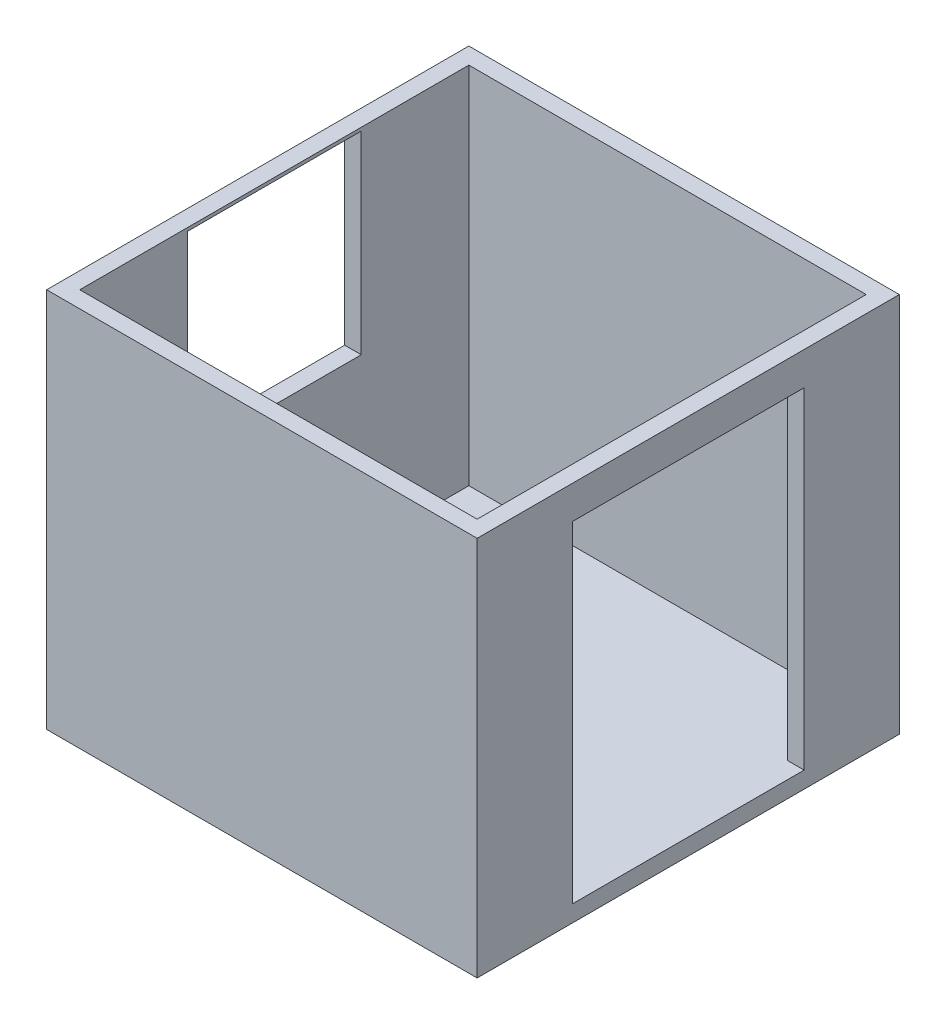
ISO-10303-21;
HEADER;
FILE_DESCRIPTION(('STEP AP214'),'2;1');
FILE_NAME('part.step','',(''),(''),'','','');
FILE_SCHEMA(('AUTOMOTIVE_DESIGN { 1 0 10303 214 1 1 1 1 }'));
ENDSEC;
DATA;
#1=APPLICATION_CONTEXT('core data for automotive mechanical design processes');
#2=APPLICATION_PROTOCOL_DEFINITION('international standard','automotive_design',2000,#1);
#3=PRODUCT_CONTEXT('',#1,'mechanical');
#4=PRODUCT('Part','Part','',(#3));
#5=PRODUCT_RELATED_PRODUCT_CATEGORY('part','',(#4));
#6=PRODUCT_DEFINITION_FORMATION('','',#4);
#7=PRODUCT_DEFINITION_CONTEXT('part definition',#1,'design');
#8=PRODUCT_DEFINITION('design','',#6,#7);
#9=PRODUCT_DEFINITION_SHAPE('','',#8);
#10=(LENGTH_UNIT() NAMED_UNIT(*) SI_UNIT(.MILLI.,.METRE.));
#11=(NAMED_UNIT(*) PLANE_ANGLE_UNIT() SI_UNIT($,.RADIAN.));
#12=(NAMED_UNIT(*) SI_UNIT($,.STERADIAN.) SOLID_ANGLE_UNIT());
#13=UNCERTAINTY_MEASURE_WITH_UNIT(LENGTH_MEASURE(1.E-05),#10,'distance_accuracy_value','');
#14=(GEOMETRIC_REPRESENTATION_CONTEXT(3) GLOBAL_UNCERTAINTY_ASSIGNED_CONTEXT((#13)) GLOBAL_UNIT_ASSIGNED_CONTEXT((#10,
#11,#12)) REPRESENTATION_CONTEXT('',''));
#15=CARTESIAN_POINT('',(0.,0.,0.));
#16=DIRECTION('',(0.,0.,1.));
#17=DIRECTION('',(1.,0.,0.));
#18=AXIS2_PLACEMENT_3D('',#15,#16,#17);
#19=CARTESIAN_POINT('',(-1300.,2200.,-1275.));
#20=DIRECTION('',(1.,0.,0.));
#21=DIRECTION('',(0.,0.,-1.));
#22=AXIS2_PLACEMENT_3D('',#19,#20,#21);
#23=PLANE('',#22);
#24=DIRECTION('',(0.,-1.,0.));
#25=VECTOR('',#24,1.);
#26=CARTESIAN_POINT('',(-1300.,2200.,-1275.));
#27=LINE('',#26,#25);
#28=CARTESIAN_POINT('',(-1300.,2200.,-1275.));
#29=VERTEX_POINT('',#28);
#30=CARTESIAN_POINT('',(-1300.,-100.,-1275.));
#31=VERTEX_POINT('',#30);
#32=EDGE_CURVE('E12',#29,#31,#27,.T.);
#33=ORIENTED_EDGE('',*,*,#32,.T.);
#34=DIRECTION('',(0.,0.,-1.));
#35=VECTOR('',#34,1.);
#36=CARTESIAN_POINT('',(-1300.,-100.,1275.));
#37=LINE('',#36,#35);
#38=CARTESIAN_POINT('',(-1300.,-100.,1275.));
#39=VERTEX_POINT('',#38);
#40=EDGE_CURVE('E240',#39,#31,#37,.T.);
#41=ORIENTED_EDGE('',*,*,#40,.F.);
#42=DIRECTION('',(0.,-1.,0.));
#43=VECTOR('',#42,1.);
#44=CARTESIAN_POINT('',(-1300.,2200.,1275.));
#45=LINE('',#44,#43);
#46=CARTESIAN_POINT('',(-1300.,2200.,1275.));
#47=VERTEX_POINT('',#46);
#48=EDGE_CURVE('E66',#47,#39,#45,.T.);
#49=ORIENTED_EDGE('',*,*,#48,.F.);
#50=DIRECTION('',(0.,0.,1.));
#51=VECTOR('',#50,1.);
#52=CARTESIAN_POINT('',(-1300.,2200.,-1275.));
#53=LINE('',#52,#51);
#54=EDGE_CURVE('E282',#29,#47,#53,.T.);
#55=ORIENTED_EDGE('',*,*,#54,.F.);
#56=EDGE_LOOP('',(#33,#41,#49,#55));
#57=FACE_BOUND('',#56,.T.);
#58=DIRECTION('',(0.,-1.,0.));
#59=VECTOR('',#58,1.);
#60=CARTESIAN_POINT('',(-1300.,0.,525.));
#61=LINE('',#60,#59);
#62=CARTESIAN_POINT('',(-1300.,2180.,525.));
#63=VERTEX_POINT('',#62);
#64=CARTESIAN_POINT('',(-1300.,1010.,525.));
#65=VERTEX_POINT('',#64);
#66=EDGE_CURVE('E176',#63,#65,#61,.T.);
#67=ORIENTED_EDGE('',*,*,#66,.T.);
#68=DIRECTION('',(0.,0.,1.));
#69=VECTOR('',#68,1.);
#70=CARTESIAN_POINT('',(-1300.,1010.,2.16127460260169E-13));
#71=LINE('',#70,#69);
#72=CARTESIAN_POINT('',(-1300.,1010.,-525.));
#73=VERTEX_POINT('',#72);
#74=EDGE_CURVE('E178',#73,#65,#71,.T.);
#75=ORIENTED_EDGE('',*,*,#74,.F.);
#76=DIRECTION('',(0.,-1.,0.));
#77=VECTOR('',#76,1.);
#78=CARTESIAN_POINT('',(-1300.,0.,-525.));
#79=LINE('',#78,#77);
#80=CARTESIAN_POINT('',(-1300.,2180.,-525.));
#81=VERTEX_POINT('',#80);
#82=EDGE_CURVE('E197',#81,#73,#79,.T.);
#83=ORIENTED_EDGE('',*,*,#82,.F.);
#84=DIRECTION('',(0.,0.,1.));
#85=VECTOR('',#84,1.);
#86=CARTESIAN_POINT('',(-1300.,2180.,2.16127460260169E-13));
#87=LINE('',#86,#85);
#88=EDGE_CURVE('E73',#81,#63,#87,.T.);
#89=ORIENTED_EDGE('',*,*,#88,.T.);
#90=EDGE_LOOP('',(#67,#75,#83,#89));
#91=FACE_BOUND('',#90,.T.);
#92=ADVANCED_FACE('F58',(#57,#91),#23,.F.);
#93=CARTESIAN_POINT('',(-1200.,2200.,-1175.));
#94=DIRECTION('',(1.,0.,0.));
#95=DIRECTION('',(0.,0.,-1.));
#96=AXIS2_PLACEMENT_3D('',#93,#94,#95);
#97=PLANE('',#96);
#98=DIRECTION('',(0.,0.,1.));
#99=VECTOR('',#98,1.);
#100=CARTESIAN_POINT('',(-1200.,0.,-1175.));
#101=LINE('',#100,#99);
#102=CARTESIAN_POINT('',(-1200.,0.,-1175.));
#103=VERTEX_POINT('',#102);
#104=CARTESIAN_POINT('',(-1200.,0.,1175.));
#105=VERTEX_POINT('',#104);
#106=EDGE_CURVE('E264',#103,#105,#101,.T.);
#107=ORIENTED_EDGE('',*,*,#106,.F.);
#108=DIRECTION('',(0.,-1.,0.));
#109=VECTOR('',#108,1.);
#110=CARTESIAN_POINT('',(-1200.,2200.,-1175.));
#111=LINE('',#110,#109);
#112=CARTESIAN_POINT('',(-1200.,2200.,-1175.));
#113=VERTEX_POINT('',#112);
#114=EDGE_CURVE('E274',#113,#103,#111,.T.);
#115=ORIENTED_EDGE('',*,*,#114,.F.);
#116=DIRECTION('',(0.,0.,1.));
#117=VECTOR('',#116,1.);
#118=CARTESIAN_POINT('',(-1200.,2200.,-1175.));
#119=LINE('',#118,#117);
#120=CARTESIAN_POINT('',(-1200.,2200.,1175.));
#121=VERTEX_POINT('',#120);
#122=EDGE_CURVE('E252',#113,#121,#119,.T.);
#123=ORIENTED_EDGE('',*,*,#122,.T.);
#124=DIRECTION('',(0.,-1.,0.));
#125=VECTOR('',#124,1.);
#126=CARTESIAN_POINT('',(-1200.,2200.,1175.));
#127=LINE('',#126,#125);
#128=EDGE_CURVE('E271',#121,#105,#127,.T.);
#129=ORIENTED_EDGE('',*,*,#128,.T.);
#130=EDGE_LOOP('',(#107,#115,#123,#129));
#131=FACE_BOUND('',#130,.T.);
#132=DIRECTION('',(0.,0.,1.));
#133=VECTOR('',#132,1.);
#134=CARTESIAN_POINT('',(-1200.,1010.,2.35765963293646E-13));
#135=LINE('',#134,#133);
#136=CARTESIAN_POINT('',(-1200.,1010.,-525.));
#137=VERTEX_POINT('',#136);
#138=CARTESIAN_POINT('',(-1200.,1010.,525.));
#139=VERTEX_POINT('',#138);
#140=EDGE_CURVE('E81',#137,#139,#135,.T.);
#141=ORIENTED_EDGE('',*,*,#140,.T.);
#142=DIRECTION('',(0.,-1.,0.));
#143=VECTOR('',#142,1.);
#144=CARTESIAN_POINT('',(-1200.,0.,525.));
#145=LINE('',#144,#143);
#146=CARTESIAN_POINT('',(-1200.,2180.,525.));
#147=VERTEX_POINT('',#146);
#148=EDGE_CURVE('E174',#147,#139,#145,.T.);
#149=ORIENTED_EDGE('',*,*,#148,.F.);
#150=DIRECTION('',(0.,0.,1.));
#151=VECTOR('',#150,1.);
#152=CARTESIAN_POINT('',(-1200.,2180.,2.35765963293646E-13));
#153=LINE('',#152,#151);
#154=CARTESIAN_POINT('',(-1200.,2180.,-525.));
#155=VERTEX_POINT('',#154);
#156=EDGE_CURVE('E181',#155,#147,#153,.T.);
#157=ORIENTED_EDGE('',*,*,#156,.F.);
#158=DIRECTION('',(0.,-1.,0.));
#159=VECTOR('',#158,1.);
#160=CARTESIAN_POINT('',(-1200.,0.,-525.));
#161=LINE('',#160,#159);
#162=EDGE_CURVE('E192',#155,#137,#161,.T.);
#163=ORIENTED_EDGE('',*,*,#162,.T.);
#164=EDGE_LOOP('',(#141,#149,#157,#163));
#165=FACE_BOUND('',#164,.T.);
#166=ADVANCED_FACE('F189',(#131,#165),#97,.T.);
#167=CARTESIAN_POINT('',(0.,2200.,0.));
#168=DIRECTION('',(0.,-1.,0.));
#169=DIRECTION('',(0.,0.,-1.));
#170=AXIS2_PLACEMENT_3D('',#167,#168,#169);
#171=PLANE('',#170);
#172=DIRECTION('',(-1.,0.,0.));
#173=VECTOR('',#172,1.);
#174=CARTESIAN_POINT('',(-1300.,2200.,-1275.));
#175=LINE('',#174,#173);
#176=CARTESIAN_POINT('',(1300.,2200.,-1275.));
#177=VERTEX_POINT('',#176);
#178=EDGE_CURVE('E279',#177,#29,#175,.T.);
#179=ORIENTED_EDGE('',*,*,#178,.T.);
#180=ORIENTED_EDGE('',*,*,#54,.T.);
#181=DIRECTION('',(1.,0.,0.));
#182=VECTOR('',#181,1.);
#183=CARTESIAN_POINT('',(-1300.,2200.,1275.));
#184=LINE('',#183,#182);
#185=CARTESIAN_POINT('',(1300.,2200.,1275.));
#186=VERTEX_POINT('',#185);
#187=EDGE_CURVE('E284',#47,#186,#184,.T.);
#188=ORIENTED_EDGE('',*,*,#187,.T.);
#189=DIRECTION('',(0.,0.,-1.));
#190=VECTOR('',#189,1.);
#191=CARTESIAN_POINT('',(1300.,2200.,-1275.));
#192=LINE('',#191,#190);
#193=EDGE_CURVE('E286',#186,#177,#192,.T.);
#194=ORIENTED_EDGE('',*,*,#193,.T.);
#195=EDGE_LOOP('',(#179,#180,#188,#194));
#196=FACE_BOUND('',#195,.T.);
#197=DIRECTION('',(0.,0.,-1.));
#198=VECTOR('',#197,1.);
#199=CARTESIAN_POINT('',(1200.,2200.,-1175.));
#200=LINE('',#199,#198);
#201=CARTESIAN_POINT('',(1200.,2200.,1175.));
#202=VERTEX_POINT('',#201);
#203=CARTESIAN_POINT('',(1200.,2200.,-1175.));
#204=VERTEX_POINT('',#203);
#205=EDGE_CURVE('E247',#202,#204,#200,.T.);
#206=ORIENTED_EDGE('',*,*,#205,.F.);
#207=DIRECTION('',(1.,0.,0.));
#208=VECTOR('',#207,1.);
#209=CARTESIAN_POINT('',(-1200.,2200.,1175.));
#210=LINE('',#209,#208);
#211=EDGE_CURVE('E255',#121,#202,#210,.T.);
#212=ORIENTED_EDGE('',*,*,#211,.F.);
#213=ORIENTED_EDGE('',*,*,#122,.F.);
#214=DIRECTION('',(-1.,0.,0.));
#215=VECTOR('',#214,1.);
#216=CARTESIAN_POINT('',(-1200.,2200.,-1175.));
#217=LINE('',#216,#215);
#218=EDGE_CURVE('E249',#204,#113,#217,.T.);
#219=ORIENTED_EDGE('',*,*,#218,.F.);
#220=EDGE_LOOP('',(#206,#212,#213,#219));
#221=FACE_BOUND('',#220,.T.);
#222=ADVANCED_FACE('F312',(#196,#221),#171,.F.);
#223=CARTESIAN_POINT('',(-1300.,2200.,-1275.));
#224=DIRECTION('',(0.,0.,1.));
#225=DIRECTION('',(1.,0.,0.));
#226=AXIS2_PLACEMENT_3D('',#223,#224,#225);
#227=PLANE('',#226);
#228=DIRECTION('',(0.,-1.,0.));
#229=VECTOR('',#228,1.);
#230=CARTESIAN_POINT('',(1300.,2200.,-1275.));
#231=LINE('',#230,#229);
#232=CARTESIAN_POINT('',(1300.,-100.,-1275.));
#233=VERTEX_POINT('',#232);
#234=EDGE_CURVE('E288',#177,#233,#231,.T.);
#235=ORIENTED_EDGE('',*,*,#234,.T.);
#236=DIRECTION('',(1.,0.,0.));
#237=VECTOR('',#236,1.);
#238=CARTESIAN_POINT('',(-1300.,-100.,-1275.));
#239=LINE('',#238,#237);
#240=EDGE_CURVE('E243',#31,#233,#239,.T.);
#241=ORIENTED_EDGE('',*,*,#240,.F.);
#242=ORIENTED_EDGE('',*,*,#32,.F.);
#243=ORIENTED_EDGE('',*,*,#178,.F.);
#244=EDGE_LOOP('',(#235,#241,#242,#243));
#245=FACE_BOUND('',#244,.T.);
#246=ADVANCED_FACE('F60',(#245),#227,.F.);
#247=CARTESIAN_POINT('',(-1300.,2200.,1275.));
#248=DIRECTION('',(0.,0.,-1.));
#249=DIRECTION('',(-1.,0.,0.));
#250=AXIS2_PLACEMENT_3D('',#247,#248,#249);
#251=PLANE('',#250);
#252=ORIENTED_EDGE('',*,*,#48,.T.);
#253=DIRECTION('',(-1.,0.,0.));
#254=VECTOR('',#253,1.);
#255=CARTESIAN_POINT('',(-1300.,-100.,1275.));
#256=LINE('',#255,#254);
#257=CARTESIAN_POINT('',(1300.,-100.,1275.));
#258=VERTEX_POINT('',#257);
#259=EDGE_CURVE('E237',#258,#39,#256,.T.);
#260=ORIENTED_EDGE('',*,*,#259,.F.);
#261=DIRECTION('',(0.,-1.,0.));
#262=VECTOR('',#261,1.);
#263=CARTESIAN_POINT('',(1300.,2200.,1275.));
#264=LINE('',#263,#262);
#265=EDGE_CURVE('E290',#186,#258,#264,.T.);
#266=ORIENTED_EDGE('',*,*,#265,.F.);
#267=ORIENTED_EDGE('',*,*,#187,.F.);
#268=EDGE_LOOP('',(#252,#260,#266,#267));
#269=FACE_BOUND('',#268,.T.);
#270=ADVANCED_FACE('F295',(#269),#251,.F.);
#271=CARTESIAN_POINT('',(1300.,2200.,-1275.));
#272=DIRECTION('',(-1.,0.,0.));
#273=DIRECTION('',(0.,0.,1.));
#274=AXIS2_PLACEMENT_3D('',#271,#272,#273);
#275=PLANE('',#274);
#276=DIRECTION('',(0.,0.,1.));
#277=VECTOR('',#276,1.);
#278=CARTESIAN_POINT('',(1300.,2000.,700.));
#279=LINE('',#278,#277);
#280=CARTESIAN_POINT('',(1300.,2000.,-699.999999999999));
#281=VERTEX_POINT('',#280);
#282=CARTESIAN_POINT('',(1300.,2000.,700.));
#283=VERTEX_POINT('',#282);
#284=EDGE_CURVE('E218',#281,#283,#279,.T.);
#285=ORIENTED_EDGE('',*,*,#284,.F.);
#286=DIRECTION('',(0.,1.,0.));
#287=VECTOR('',#286,1.);
#288=CARTESIAN_POINT('',(1300.,2000.,-699.999999999999));
#289=LINE('',#288,#287);
#290=CARTESIAN_POINT('',(1300.,0.,-700.));
#291=VERTEX_POINT('',#290);
#292=EDGE_CURVE('E221',#291,#281,#289,.T.);
#293=ORIENTED_EDGE('',*,*,#292,.F.);
#294=DIRECTION('',(0.,0.,-1.));
#295=VECTOR('',#294,1.);
#296=CARTESIAN_POINT('',(1300.,0.,700.));
#297=LINE('',#296,#295);
#298=CARTESIAN_POINT('',(1300.,0.,700.));
#299=VERTEX_POINT('',#298);
#300=EDGE_CURVE('E211',#299,#291,#297,.T.);
#301=ORIENTED_EDGE('',*,*,#300,.F.);
#302=DIRECTION('',(0.,-1.,0.));
#303=VECTOR('',#302,1.);
#304=CARTESIAN_POINT('',(1300.,2000.,700.));
#305=LINE('',#304,#303);
#306=EDGE_CURVE('E215',#283,#299,#305,.T.);
#307=ORIENTED_EDGE('',*,*,#306,.F.);
#308=EDGE_LOOP('',(#285,#293,#301,#307));
#309=FACE_BOUND('',#308,.T.);
#310=ORIENTED_EDGE('',*,*,#265,.T.);
#311=DIRECTION('',(0.,0.,1.));
#312=VECTOR('',#311,1.);
#313=CARTESIAN_POINT('',(1300.,-100.,1275.));
#314=LINE('',#313,#312);
#315=EDGE_CURVE('E214',#233,#258,#314,.T.);
#316=ORIENTED_EDGE('',*,*,#315,.F.);
#317=ORIENTED_EDGE('',*,*,#234,.F.);
#318=ORIENTED_EDGE('',*,*,#193,.F.);
#319=EDGE_LOOP('',(#310,#316,#317,#318));
#320=FACE_BOUND('',#319,.T.);
#321=ADVANCED_FACE('F309',(#309,#320),#275,.F.);
#322=CARTESIAN_POINT('',(1200.,2200.,-1175.));
#323=DIRECTION('',(-1.,0.,0.));
#324=DIRECTION('',(0.,0.,1.));
#325=AXIS2_PLACEMENT_3D('',#322,#323,#324);
#326=PLANE('',#325);
#327=DIRECTION('',(0.,1.,0.));
#328=VECTOR('',#327,1.);
#329=CARTESIAN_POINT('',(1200.,2000.,-699.999999999999));
#330=LINE('',#329,#328);
#331=CARTESIAN_POINT('',(1200.,0.,-700.));
#332=VERTEX_POINT('',#331);
#333=CARTESIAN_POINT('',(1200.,2000.,-699.999999999999));
#334=VERTEX_POINT('',#333);
#335=EDGE_CURVE('E186',#332,#334,#330,.T.);
#336=ORIENTED_EDGE('',*,*,#335,.T.);
#337=DIRECTION('',(0.,0.,1.));
#338=VECTOR('',#337,1.);
#339=CARTESIAN_POINT('',(1200.,2000.,700.));
#340=LINE('',#339,#338);
#341=CARTESIAN_POINT('',(1200.,2000.,700.));
#342=VERTEX_POINT('',#341);
#343=EDGE_CURVE('E206',#334,#342,#340,.T.);
#344=ORIENTED_EDGE('',*,*,#343,.T.);
#345=DIRECTION('',(0.,-1.,0.));
#346=VECTOR('',#345,1.);
#347=CARTESIAN_POINT('',(1200.,2000.,700.));
#348=LINE('',#347,#346);
#349=CARTESIAN_POINT('',(1200.,0.,700.));
#350=VERTEX_POINT('',#349);
#351=EDGE_CURVE('E226',#342,#350,#348,.T.);
#352=ORIENTED_EDGE('',*,*,#351,.T.);
#353=DIRECTION('',(0.,0.,-1.));
#354=VECTOR('',#353,1.);
#355=CARTESIAN_POINT('',(1200.,0.,-1175.));
#356=LINE('',#355,#354);
#357=CARTESIAN_POINT('',(1200.,0.,1175.));
#358=VERTEX_POINT('',#357);
#359=EDGE_CURVE('E258',#358,#350,#356,.T.);
#360=ORIENTED_EDGE('',*,*,#359,.F.);
#361=DIRECTION('',(0.,-1.,0.));
#362=VECTOR('',#361,1.);
#363=CARTESIAN_POINT('',(1200.,2200.,1175.));
#364=LINE('',#363,#362);
#365=EDGE_CURVE('E257',#202,#358,#364,.T.);
#366=ORIENTED_EDGE('',*,*,#365,.F.);
#367=ORIENTED_EDGE('',*,*,#205,.T.);
#368=DIRECTION('',(0.,-1.,0.));
#369=VECTOR('',#368,1.);
#370=CARTESIAN_POINT('',(1200.,2200.,-1175.));
#371=LINE('',#370,#369);
#372=CARTESIAN_POINT('',(1200.,0.,-1175.));
#373=VERTEX_POINT('',#372);
#374=EDGE_CURVE('E276',#204,#373,#371,.T.);
#375=ORIENTED_EDGE('',*,*,#374,.T.);
#376=EDGE_CURVE('E246',#332,#373,#356,.T.);
#377=ORIENTED_EDGE('',*,*,#376,.F.);
#378=EDGE_LOOP('',(#336,#344,#352,#360,#366,#367,#375,#377));
#379=FACE_BOUND('',#378,.T.);
#380=ADVANCED_FACE('F323',(#379),#326,.T.);
#381=CARTESIAN_POINT('',(-1200.,2200.,-1175.));
#382=DIRECTION('',(0.,0.,1.));
#383=DIRECTION('',(1.,0.,0.));
#384=AXIS2_PLACEMENT_3D('',#381,#382,#383);
#385=PLANE('',#384);
#386=DIRECTION('',(-1.,0.,0.));
#387=VECTOR('',#386,1.);
#388=CARTESIAN_POINT('',(-1200.,0.,-1175.));
#389=LINE('',#388,#387);
#390=EDGE_CURVE('E261',#373,#103,#389,.T.);
#391=ORIENTED_EDGE('',*,*,#390,.F.);
#392=ORIENTED_EDGE('',*,*,#374,.F.);
#393=ORIENTED_EDGE('',*,*,#218,.T.);
#394=ORIENTED_EDGE('',*,*,#114,.T.);
#395=EDGE_LOOP('',(#391,#392,#393,#394));
#396=FACE_BOUND('',#395,.T.);
#397=ADVANCED_FACE('F327',(#396),#385,.T.);
#398=CARTESIAN_POINT('',(-1200.,2200.,1175.));
#399=DIRECTION('',(0.,0.,-1.));
#400=DIRECTION('',(-1.,0.,0.));
#401=AXIS2_PLACEMENT_3D('',#398,#399,#400);
#402=PLANE('',#401);
#403=DIRECTION('',(1.,0.,0.));
#404=VECTOR('',#403,1.);
#405=CARTESIAN_POINT('',(-1200.,0.,1175.));
#406=LINE('',#405,#404);
#407=EDGE_CURVE('E250',#105,#358,#406,.T.);
#408=ORIENTED_EDGE('',*,*,#407,.F.);
#409=ORIENTED_EDGE('',*,*,#128,.F.);
#410=ORIENTED_EDGE('',*,*,#211,.T.);
#411=ORIENTED_EDGE('',*,*,#365,.T.);
#412=EDGE_LOOP('',(#408,#409,#410,#411));
#413=FACE_BOUND('',#412,.T.);
#414=ADVANCED_FACE('F347',(#413),#402,.T.);
#415=CARTESIAN_POINT('',(0.,0.,0.));
#416=DIRECTION('',(0.,-1.,0.));
#417=DIRECTION('',(0.,0.,-1.));
#418=AXIS2_PLACEMENT_3D('',#415,#416,#417);
#419=PLANE('',#418);
#420=ORIENTED_EDGE('',*,*,#106,.T.);
#421=ORIENTED_EDGE('',*,*,#407,.T.);
#422=ORIENTED_EDGE('',*,*,#359,.T.);
#423=DIRECTION('',(1.,0.,0.));
#424=VECTOR('',#423,1.);
#425=CARTESIAN_POINT('',(-1300.001,0.,700.));
#426=LINE('',#425,#424);
#427=EDGE_CURVE('E210',#350,#299,#426,.T.);
#428=ORIENTED_EDGE('',*,*,#427,.T.);
#429=ORIENTED_EDGE('',*,*,#300,.T.);
#430=DIRECTION('',(1.,0.,0.));
#431=VECTOR('',#430,1.);
#432=CARTESIAN_POINT('',(-1300.001,0.,-699.999999999999));
#433=LINE('',#432,#431);
#434=EDGE_CURVE('E229',#332,#291,#433,.T.);
#435=ORIENTED_EDGE('',*,*,#434,.F.);
#436=ORIENTED_EDGE('',*,*,#376,.T.);
#437=ORIENTED_EDGE('',*,*,#390,.T.);
#438=EDGE_LOOP('',(#420,#421,#422,#428,#429,#435,#436,#437));
#439=FACE_BOUND('',#438,.T.);
#440=ADVANCED_FACE('F331',(#439),#419,.F.);
#441=CARTESIAN_POINT('',(0.,-100.,0.));
#442=DIRECTION('',(0.,-1.,0.));
#443=DIRECTION('',(0.,0.,-1.));
#444=AXIS2_PLACEMENT_3D('',#441,#442,#443);
#445=PLANE('',#444);
#446=ORIENTED_EDGE('',*,*,#315,.T.);
#447=ORIENTED_EDGE('',*,*,#259,.T.);
#448=ORIENTED_EDGE('',*,*,#40,.T.);
#449=ORIENTED_EDGE('',*,*,#240,.T.);
#450=EDGE_LOOP('',(#446,#447,#448,#449));
#451=FACE_BOUND('',#450,.T.);
#452=ADVANCED_FACE('F300',(#451),#445,.T.);
#453=CARTESIAN_POINT('',(-1300.001,2000.,-699.999999999999));
#454=DIRECTION('',(0.,0.,-1.));
#455=DIRECTION('',(0.,1.,0.));
#456=AXIS2_PLACEMENT_3D('',#453,#454,#455);
#457=PLANE('',#456);
#458=ORIENTED_EDGE('',*,*,#434,.T.);
#459=ORIENTED_EDGE('',*,*,#292,.T.);
#460=DIRECTION('',(1.,0.,0.));
#461=VECTOR('',#460,1.);
#462=CARTESIAN_POINT('',(-1300.001,2000.,-699.999999999999));
#463=LINE('',#462,#461);
#464=EDGE_CURVE('E225',#334,#281,#463,.T.);
#465=ORIENTED_EDGE('',*,*,#464,.F.);
#466=ORIENTED_EDGE('',*,*,#335,.F.);
#467=EDGE_LOOP('',(#458,#459,#465,#466));
#468=FACE_BOUND('',#467,.T.);
#469=ADVANCED_FACE('F335',(#468),#457,.F.);
#470=CARTESIAN_POINT('',(-1300.001,2000.,700.000000000001));
#471=DIRECTION('',(0.,0.,1.));
#472=DIRECTION('',(0.,-1.,0.));
#473=AXIS2_PLACEMENT_3D('',#470,#471,#472);
#474=PLANE('',#473);
#475=DIRECTION('',(1.,0.,0.));
#476=VECTOR('',#475,1.);
#477=CARTESIAN_POINT('',(-1300.001,2000.,700.000000000001));
#478=LINE('',#477,#476);
#479=EDGE_CURVE('E209',#342,#283,#478,.T.);
#480=ORIENTED_EDGE('',*,*,#479,.T.);
#481=ORIENTED_EDGE('',*,*,#306,.T.);
#482=ORIENTED_EDGE('',*,*,#427,.F.);
#483=ORIENTED_EDGE('',*,*,#351,.F.);
#484=EDGE_LOOP('',(#480,#481,#482,#483));
#485=FACE_BOUND('',#484,.T.);
#486=ADVANCED_FACE('F345',(#485),#474,.F.);
#487=CARTESIAN_POINT('',(-1300.001,2000.,700.000000000001));
#488=DIRECTION('',(0.,1.,0.));
#489=DIRECTION('',(0.,0.,1.));
#490=AXIS2_PLACEMENT_3D('',#487,#488,#489);
#491=PLANE('',#490);
#492=ORIENTED_EDGE('',*,*,#464,.T.);
#493=ORIENTED_EDGE('',*,*,#284,.T.);
#494=ORIENTED_EDGE('',*,*,#479,.F.);
#495=ORIENTED_EDGE('',*,*,#343,.F.);
#496=EDGE_LOOP('',(#492,#493,#494,#495));
#497=FACE_BOUND('',#496,.T.);
#498=ADVANCED_FACE('F339',(#497),#491,.F.);
#499=CARTESIAN_POINT('',(1300.001,0.,525.));
#500=DIRECTION('',(0.,0.,-1.));
#501=DIRECTION('',(-1.,0.,0.));
#502=AXIS2_PLACEMENT_3D('',#499,#500,#501);
#503=PLANE('',#502);
#504=ORIENTED_EDGE('',*,*,#148,.T.);
#505=DIRECTION('',(-1.,0.,0.));
#506=VECTOR('',#505,1.);
#507=CARTESIAN_POINT('',(1300.001,1010.,525.));
#508=LINE('',#507,#506);
#509=EDGE_CURVE('E187',#139,#65,#508,.T.);
#510=ORIENTED_EDGE('',*,*,#509,.T.);
#511=ORIENTED_EDGE('',*,*,#66,.F.);
#512=DIRECTION('',(-1.,0.,0.));
#513=VECTOR('',#512,1.);
#514=CARTESIAN_POINT('',(1300.001,2180.,525.));
#515=LINE('',#514,#513);
#516=EDGE_CURVE('E170',#147,#63,#515,.T.);
#517=ORIENTED_EDGE('',*,*,#516,.F.);
#518=EDGE_LOOP('',(#504,#510,#511,#517));
#519=FACE_BOUND('',#518,.T.);
#520=ADVANCED_FACE('F172',(#519),#503,.T.);
#521=CARTESIAN_POINT('',(1300.001,2180.,-2.36669555308213E-13));
#522=DIRECTION('',(0.,-1.,0.));
#523=DIRECTION('',(0.,0.,-1.));
#524=AXIS2_PLACEMENT_3D('',#521,#522,#523);
#525=PLANE('',#524);
#526=ORIENTED_EDGE('',*,*,#156,.T.);
#527=ORIENTED_EDGE('',*,*,#516,.T.);
#528=ORIENTED_EDGE('',*,*,#88,.F.);
#529=DIRECTION('',(-1.,0.,0.));
#530=VECTOR('',#529,1.);
#531=CARTESIAN_POINT('',(1300.001,2180.,-525.));
#532=LINE('',#531,#530);
#533=EDGE_CURVE('E177',#155,#81,#532,.T.);
#534=ORIENTED_EDGE('',*,*,#533,.F.);
#535=EDGE_LOOP('',(#526,#527,#528,#534));
#536=FACE_BOUND('',#535,.T.);
#537=ADVANCED_FACE('F182',(#536),#525,.T.);
#538=CARTESIAN_POINT('',(1300.001,1010.,-2.36669555308213E-13));
#539=DIRECTION('',(0.,-1.,0.));
#540=DIRECTION('',(0.,0.,-1.));
#541=AXIS2_PLACEMENT_3D('',#538,#539,#540);
#542=PLANE('',#541);
#543=DIRECTION('',(-1.,0.,0.));
#544=VECTOR('',#543,1.);
#545=CARTESIAN_POINT('',(1300.001,1010.,-525.));
#546=LINE('',#545,#544);
#547=EDGE_CURVE('E203',#137,#73,#546,.T.);
#548=ORIENTED_EDGE('',*,*,#547,.T.);
#549=ORIENTED_EDGE('',*,*,#74,.T.);
#550=ORIENTED_EDGE('',*,*,#509,.F.);
#551=ORIENTED_EDGE('',*,*,#140,.F.);
#552=EDGE_LOOP('',(#548,#549,#550,#551));
#553=FACE_BOUND('',#552,.T.);
#554=ADVANCED_FACE('F458',(#553),#542,.F.);
#555=CARTESIAN_POINT('',(1300.001,0.,-525.));
#556=DIRECTION('',(0.,0.,-1.));
#557=DIRECTION('',(-1.,0.,0.));
#558=AXIS2_PLACEMENT_3D('',#555,#556,#557);
#559=PLANE('',#558);
#560=ORIENTED_EDGE('',*,*,#533,.T.);
#561=ORIENTED_EDGE('',*,*,#82,.T.);
#562=ORIENTED_EDGE('',*,*,#547,.F.);
#563=ORIENTED_EDGE('',*,*,#162,.F.);
#564=EDGE_LOOP('',(#560,#561,#562,#563));
#565=FACE_BOUND('',#564,.T.);
#566=ADVANCED_FACE('F465',(#565),#559,.F.);
#567=CLOSED_SHELL('',(#92,#166,#222,#246,#270,#321,#380,#397,#414,#440,#452,#469,#486,#498,#520,
#537,#554,#566));
#568=MANIFOLD_SOLID_BREP('B2',#567);
#569=ADVANCED_BREP_SHAPE_REPRESENTATION('',(#18,#568),#14);
#570=SHAPE_DEFINITION_REPRESENTATION(#9,#569);
ENDSEC;
END-ISO-10303-21;
